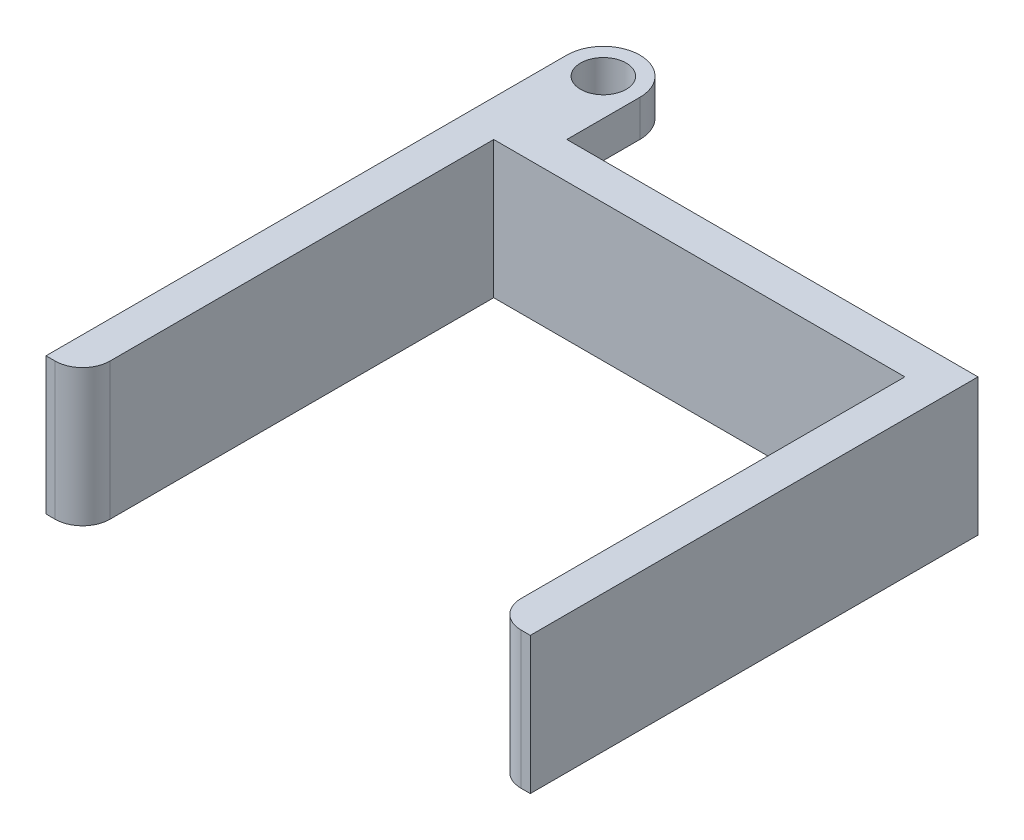
ISO-10303-21;
HEADER;
FILE_DESCRIPTION(('STEP AP214'),'2;1');
FILE_NAME('part.step','',(''),(''),'','','');
FILE_SCHEMA(('AUTOMOTIVE_DESIGN { 1 0 10303 214 1 1 1 1 }'));
ENDSEC;
DATA;
#1=APPLICATION_CONTEXT('core data for automotive mechanical design processes');
#2=APPLICATION_PROTOCOL_DEFINITION('international standard','automotive_design',2000,#1);
#3=PRODUCT_CONTEXT('',#1,'mechanical');
#4=PRODUCT('Part','Part','',(#3));
#5=PRODUCT_RELATED_PRODUCT_CATEGORY('part','',(#4));
#6=PRODUCT_DEFINITION_FORMATION('','',#4);
#7=PRODUCT_DEFINITION_CONTEXT('part definition',#1,'design');
#8=PRODUCT_DEFINITION('design','',#6,#7);
#9=PRODUCT_DEFINITION_SHAPE('','',#8);
#10=(LENGTH_UNIT() NAMED_UNIT(*) SI_UNIT(.MILLI.,.METRE.));
#11=(NAMED_UNIT(*) PLANE_ANGLE_UNIT() SI_UNIT($,.RADIAN.));
#12=(NAMED_UNIT(*) SI_UNIT($,.STERADIAN.) SOLID_ANGLE_UNIT());
#13=UNCERTAINTY_MEASURE_WITH_UNIT(LENGTH_MEASURE(1.E-05),#10,'distance_accuracy_value','');
#14=(GEOMETRIC_REPRESENTATION_CONTEXT(3) GLOBAL_UNCERTAINTY_ASSIGNED_CONTEXT((#13)) GLOBAL_UNIT_ASSIGNED_CONTEXT((#10,
#11,#12)) REPRESENTATION_CONTEXT('',''));
#15=CARTESIAN_POINT('',(0.,0.,0.));
#16=DIRECTION('',(0.,0.,1.));
#17=DIRECTION('',(1.,0.,0.));
#18=AXIS2_PLACEMENT_3D('',#15,#16,#17);
#19=CARTESIAN_POINT('',(22.5,15.,0.));
#20=DIRECTION('',(-1.,0.,0.));
#21=DIRECTION('',(0.,0.,1.));
#22=AXIS2_PLACEMENT_3D('',#19,#20,#21);
#23=PLANE('',#22);
#24=DIRECTION('',(0.,0.,-1.));
#25=VECTOR('',#24,1.);
#26=CARTESIAN_POINT('',(22.5,0.,0.));
#27=LINE('',#26,#25);
#28=CARTESIAN_POINT('',(22.5,0.,19.5));
#29=VERTEX_POINT('',#28);
#30=CARTESIAN_POINT('',(22.5,0.,-22.5));
#31=VERTEX_POINT('',#30);
#32=EDGE_CURVE('E167',#29,#31,#27,.T.);
#33=ORIENTED_EDGE('',*,*,#32,.F.);
#34=DIRECTION('',(0.,-1.,0.));
#35=VECTOR('',#34,1.);
#36=CARTESIAN_POINT('',(22.5,15.,19.5));
#37=LINE('',#36,#35);
#38=CARTESIAN_POINT('',(22.5,15.,19.5));
#39=VERTEX_POINT('',#38);
#40=EDGE_CURVE('E207',#29,#39,#37,.F.);
#41=ORIENTED_EDGE('',*,*,#40,.T.);
#42=DIRECTION('',(0.,0.,-1.));
#43=VECTOR('',#42,1.);
#44=CARTESIAN_POINT('',(22.5,15.,0.));
#45=LINE('',#44,#43);
#46=CARTESIAN_POINT('',(22.5,15.,-22.5));
#47=VERTEX_POINT('',#46);
#48=EDGE_CURVE('E231',#39,#47,#45,.T.);
#49=ORIENTED_EDGE('',*,*,#48,.T.);
#50=DIRECTION('',(0.,-1.,0.));
#51=VECTOR('',#50,1.);
#52=CARTESIAN_POINT('',(22.5,15.,-22.5));
#53=LINE('',#52,#51);
#54=EDGE_CURVE('E237',#47,#31,#53,.T.);
#55=ORIENTED_EDGE('',*,*,#54,.T.);
#56=EDGE_LOOP('',(#33,#41,#49,#55));
#57=FACE_BOUND('',#56,.T.);
#58=ADVANCED_FACE('F33',(#57),#23,.T.);
#59=CARTESIAN_POINT('',(0.,15.,22.5));
#60=DIRECTION('',(0.,0.,-1.));
#61=DIRECTION('',(-1.,0.,0.));
#62=AXIS2_PLACEMENT_3D('',#59,#60,#61);
#63=PLANE('',#62);
#64=DIRECTION('',(1.,0.,0.));
#65=VECTOR('',#64,1.);
#66=CARTESIAN_POINT('',(0.,15.,22.5));
#67=LINE('',#66,#65);
#68=CARTESIAN_POINT('',(25.5,15.,22.5));
#69=VERTEX_POINT('',#68);
#70=CARTESIAN_POINT('',(26.5,15.,22.5));
#71=VERTEX_POINT('',#70);
#72=EDGE_CURVE('E272',#69,#71,#67,.T.);
#73=ORIENTED_EDGE('',*,*,#72,.F.);
#74=DIRECTION('',(0.,-1.,0.));
#75=VECTOR('',#74,1.);
#76=CARTESIAN_POINT('',(25.5,0.,22.5));
#77=LINE('',#76,#75);
#78=CARTESIAN_POINT('',(25.5,0.,22.5));
#79=VERTEX_POINT('',#78);
#80=EDGE_CURVE('E200',#69,#79,#77,.T.);
#81=ORIENTED_EDGE('',*,*,#80,.T.);
#82=DIRECTION('',(1.,0.,0.));
#83=VECTOR('',#82,1.);
#84=CARTESIAN_POINT('',(0.,0.,22.5));
#85=LINE('',#84,#83);
#86=CARTESIAN_POINT('',(26.5,0.,22.5));
#87=VERTEX_POINT('',#86);
#88=EDGE_CURVE('E252',#79,#87,#85,.T.);
#89=ORIENTED_EDGE('',*,*,#88,.T.);
#90=DIRECTION('',(0.,-1.,0.));
#91=VECTOR('',#90,1.);
#92=CARTESIAN_POINT('',(26.5,15.,22.5));
#93=LINE('',#92,#91);
#94=EDGE_CURVE('E186',#71,#87,#93,.T.);
#95=ORIENTED_EDGE('',*,*,#94,.F.);
#96=EDGE_LOOP('',(#73,#81,#89,#95));
#97=FACE_BOUND('',#96,.T.);
#98=ADVANCED_FACE('F283',(#97),#63,.F.);
#99=CARTESIAN_POINT('',(26.5,15.,0.));
#100=DIRECTION('',(-1.,0.,0.));
#101=DIRECTION('',(0.,0.,1.));
#102=AXIS2_PLACEMENT_3D('',#99,#100,#101);
#103=PLANE('',#102);
#104=DIRECTION('',(0.,0.,-1.));
#105=VECTOR('',#104,1.);
#106=CARTESIAN_POINT('',(26.5,0.,0.));
#107=LINE('',#106,#105);
#108=CARTESIAN_POINT('',(26.5,0.,-26.5));
#109=VERTEX_POINT('',#108);
#110=EDGE_CURVE('E254',#87,#109,#107,.T.);
#111=ORIENTED_EDGE('',*,*,#110,.T.);
#112=DIRECTION('',(0.,-1.,0.));
#113=VECTOR('',#112,1.);
#114=CARTESIAN_POINT('',(26.5,15.,-26.5));
#115=LINE('',#114,#113);
#116=CARTESIAN_POINT('',(26.5,15.,-26.5));
#117=VERTEX_POINT('',#116);
#118=EDGE_CURVE('E183',#117,#109,#115,.T.);
#119=ORIENTED_EDGE('',*,*,#118,.F.);
#120=DIRECTION('',(0.,0.,-1.));
#121=VECTOR('',#120,1.);
#122=CARTESIAN_POINT('',(26.5,15.,0.));
#123=LINE('',#122,#121);
#124=EDGE_CURVE('E267',#71,#117,#123,.T.);
#125=ORIENTED_EDGE('',*,*,#124,.F.);
#126=ORIENTED_EDGE('',*,*,#94,.T.);
#127=EDGE_LOOP('',(#111,#119,#125,#126));
#128=FACE_BOUND('',#127,.T.);
#129=ADVANCED_FACE('F287',(#128),#103,.F.);
#130=CARTESIAN_POINT('',(0.,15.,-26.5));
#131=DIRECTION('',(0.,0.,-1.));
#132=DIRECTION('',(-1.,0.,0.));
#133=AXIS2_PLACEMENT_3D('',#130,#131,#132);
#134=PLANE('',#133);
#135=DIRECTION('',(-1.,0.,0.));
#136=VECTOR('',#135,1.);
#137=CARTESIAN_POINT('',(0.,11.,-26.5));
#138=LINE('',#137,#136);
#139=CARTESIAN_POINT('',(-18.5,11.,-26.5));
#140=VERTEX_POINT('',#139);
#141=CARTESIAN_POINT('',(-26.5,11.,-26.5));
#142=VERTEX_POINT('',#141);
#143=EDGE_CURVE('E155',#140,#142,#138,.T.);
#144=ORIENTED_EDGE('',*,*,#143,.F.);
#145=DIRECTION('',(0.,1.,0.));
#146=VECTOR('',#145,1.);
#147=CARTESIAN_POINT('',(-18.5,11.,-26.5));
#148=LINE('',#147,#146);
#149=CARTESIAN_POINT('',(-18.5,15.,-26.5));
#150=VERTEX_POINT('',#149);
#151=EDGE_CURVE('E144',#140,#150,#148,.T.);
#152=ORIENTED_EDGE('',*,*,#151,.T.);
#153=DIRECTION('',(1.,0.,0.));
#154=VECTOR('',#153,1.);
#155=CARTESIAN_POINT('',(0.,15.,-26.5));
#156=LINE('',#155,#154);
#157=EDGE_CURVE('E193',#150,#117,#156,.T.);
#158=ORIENTED_EDGE('',*,*,#157,.T.);
#159=ORIENTED_EDGE('',*,*,#118,.T.);
#160=DIRECTION('',(1.,0.,0.));
#161=VECTOR('',#160,1.);
#162=CARTESIAN_POINT('',(0.,0.,-26.5));
#163=LINE('',#162,#161);
#164=CARTESIAN_POINT('',(-26.5,0.,-26.5));
#165=VERTEX_POINT('',#164);
#166=EDGE_CURVE('E181',#165,#109,#163,.T.);
#167=ORIENTED_EDGE('',*,*,#166,.F.);
#168=DIRECTION('',(0.,-1.,0.));
#169=VECTOR('',#168,1.);
#170=CARTESIAN_POINT('',(-26.5,15.,-26.5));
#171=LINE('',#170,#169);
#172=EDGE_CURVE('E177',#142,#165,#171,.T.);
#173=ORIENTED_EDGE('',*,*,#172,.F.);
#174=EDGE_LOOP('',(#144,#152,#158,#159,#167,#173));
#175=FACE_BOUND('',#174,.T.);
#176=ADVANCED_FACE('F179',(#175),#134,.T.);
#177=CARTESIAN_POINT('',(-26.5,15.,0.));
#178=DIRECTION('',(-1.,0.,0.));
#179=DIRECTION('',(0.,0.,1.));
#180=AXIS2_PLACEMENT_3D('',#177,#178,#179);
#181=PLANE('',#180);
#182=DIRECTION('',(0.,0.,-1.));
#183=VECTOR('',#182,1.);
#184=CARTESIAN_POINT('',(-26.5,0.,0.));
#185=LINE('',#184,#183);
#186=CARTESIAN_POINT('',(-26.5,0.,22.5));
#187=VERTEX_POINT('',#186);
#188=EDGE_CURVE('E233',#187,#165,#185,.T.);
#189=ORIENTED_EDGE('',*,*,#188,.F.);
#190=DIRECTION('',(0.,-1.,0.));
#191=VECTOR('',#190,1.);
#192=CARTESIAN_POINT('',(-26.5,15.,22.5));
#193=LINE('',#192,#191);
#194=CARTESIAN_POINT('',(-26.5,15.,22.5));
#195=VERTEX_POINT('',#194);
#196=EDGE_CURVE('E184',#195,#187,#193,.T.);
#197=ORIENTED_EDGE('',*,*,#196,.F.);
#198=DIRECTION('',(0.,0.,-1.));
#199=VECTOR('',#198,1.);
#200=CARTESIAN_POINT('',(-26.5,15.,0.));
#201=LINE('',#200,#199);
#202=CARTESIAN_POINT('',(-26.5,15.,-34.5));
#203=VERTEX_POINT('',#202);
#204=EDGE_CURVE('E260',#195,#203,#201,.T.);
#205=ORIENTED_EDGE('',*,*,#204,.T.);
#206=DIRECTION('',(0.,1.,0.));
#207=VECTOR('',#206,1.);
#208=CARTESIAN_POINT('',(-26.5,11.,-34.5));
#209=LINE('',#208,#207);
#210=CARTESIAN_POINT('',(-26.5,11.,-34.5));
#211=VERTEX_POINT('',#210);
#212=EDGE_CURVE('E139',#211,#203,#209,.T.);
#213=ORIENTED_EDGE('',*,*,#212,.F.);
#214=DIRECTION('',(0.,0.,1.));
#215=VECTOR('',#214,1.);
#216=CARTESIAN_POINT('',(-26.5,11.,0.));
#217=LINE('',#216,#215);
#218=EDGE_CURVE('E153',#211,#142,#217,.T.);
#219=ORIENTED_EDGE('',*,*,#218,.T.);
#220=ORIENTED_EDGE('',*,*,#172,.T.);
#221=EDGE_LOOP('',(#189,#197,#205,#213,#219,#220));
#222=FACE_BOUND('',#221,.T.);
#223=ADVANCED_FACE('F176',(#222),#181,.T.);
#224=CARTESIAN_POINT('',(0.,15.,22.5));
#225=DIRECTION('',(0.,0.,-1.));
#226=DIRECTION('',(-1.,0.,0.));
#227=AXIS2_PLACEMENT_3D('',#224,#225,#226);
#228=PLANE('',#227);
#229=DIRECTION('',(1.,0.,0.));
#230=VECTOR('',#229,1.);
#231=CARTESIAN_POINT('',(0.,0.,22.5));
#232=LINE('',#231,#230);
#233=CARTESIAN_POINT('',(-25.5,0.,22.5));
#234=VERTEX_POINT('',#233);
#235=EDGE_CURVE('E229',#187,#234,#232,.T.);
#236=ORIENTED_EDGE('',*,*,#235,.T.);
#237=DIRECTION('',(0.,-1.,0.));
#238=VECTOR('',#237,1.);
#239=CARTESIAN_POINT('',(-25.5,15.,22.5));
#240=LINE('',#239,#238);
#241=CARTESIAN_POINT('',(-25.5,15.,22.5));
#242=VERTEX_POINT('',#241);
#243=EDGE_CURVE('E11',#234,#242,#240,.F.);
#244=ORIENTED_EDGE('',*,*,#243,.T.);
#245=DIRECTION('',(1.,0.,0.));
#246=VECTOR('',#245,1.);
#247=CARTESIAN_POINT('',(0.,15.,22.5));
#248=LINE('',#247,#246);
#249=EDGE_CURVE('E247',#195,#242,#248,.T.);
#250=ORIENTED_EDGE('',*,*,#249,.F.);
#251=ORIENTED_EDGE('',*,*,#196,.T.);
#252=EDGE_LOOP('',(#236,#244,#250,#251));
#253=FACE_BOUND('',#252,.T.);
#254=ADVANCED_FACE('F262',(#253),#228,.F.);
#255=CARTESIAN_POINT('',(-22.5,15.,0.));
#256=DIRECTION('',(-1.,0.,0.));
#257=DIRECTION('',(0.,0.,1.));
#258=AXIS2_PLACEMENT_3D('',#255,#256,#257);
#259=PLANE('',#258);
#260=DIRECTION('',(0.,0.,-1.));
#261=VECTOR('',#260,1.);
#262=CARTESIAN_POINT('',(-22.5,15.,0.));
#263=LINE('',#262,#261);
#264=CARTESIAN_POINT('',(-22.5,15.,19.5));
#265=VERTEX_POINT('',#264);
#266=CARTESIAN_POINT('',(-22.5,15.,-22.5));
#267=VERTEX_POINT('',#266);
#268=EDGE_CURVE('E219',#265,#267,#263,.T.);
#269=ORIENTED_EDGE('',*,*,#268,.F.);
#270=DIRECTION('',(0.,-1.,0.));
#271=VECTOR('',#270,1.);
#272=CARTESIAN_POINT('',(-22.5,15.,19.5));
#273=LINE('',#272,#271);
#274=CARTESIAN_POINT('',(-22.5,0.,19.5));
#275=VERTEX_POINT('',#274);
#276=EDGE_CURVE('E42',#265,#275,#273,.T.);
#277=ORIENTED_EDGE('',*,*,#276,.T.);
#278=DIRECTION('',(0.,0.,-1.));
#279=VECTOR('',#278,1.);
#280=CARTESIAN_POINT('',(-22.5,0.,0.));
#281=LINE('',#280,#279);
#282=CARTESIAN_POINT('',(-22.5,0.,-22.5));
#283=VERTEX_POINT('',#282);
#284=EDGE_CURVE('E217',#275,#283,#281,.T.);
#285=ORIENTED_EDGE('',*,*,#284,.T.);
#286=DIRECTION('',(0.,-1.,0.));
#287=VECTOR('',#286,1.);
#288=CARTESIAN_POINT('',(-22.5,15.,-22.5));
#289=LINE('',#288,#287);
#290=EDGE_CURVE('E188',#267,#283,#289,.T.);
#291=ORIENTED_EDGE('',*,*,#290,.F.);
#292=EDGE_LOOP('',(#269,#277,#285,#291));
#293=FACE_BOUND('',#292,.T.);
#294=ADVANCED_FACE('F215',(#293),#259,.F.);
#295=CARTESIAN_POINT('',(0.,15.,-22.5));
#296=DIRECTION('',(0.,0.,-1.));
#297=DIRECTION('',(-1.,0.,0.));
#298=AXIS2_PLACEMENT_3D('',#295,#296,#297);
#299=PLANE('',#298);
#300=DIRECTION('',(1.,0.,0.));
#301=VECTOR('',#300,1.);
#302=CARTESIAN_POINT('',(0.,0.,-22.5));
#303=LINE('',#302,#301);
#304=EDGE_CURVE('E228',#283,#31,#303,.T.);
#305=ORIENTED_EDGE('',*,*,#304,.T.);
#306=ORIENTED_EDGE('',*,*,#54,.F.);
#307=DIRECTION('',(1.,0.,0.));
#308=VECTOR('',#307,1.);
#309=CARTESIAN_POINT('',(0.,15.,-22.5));
#310=LINE('',#309,#308);
#311=EDGE_CURVE('E239',#267,#47,#310,.T.);
#312=ORIENTED_EDGE('',*,*,#311,.F.);
#313=ORIENTED_EDGE('',*,*,#290,.T.);
#314=EDGE_LOOP('',(#305,#306,#312,#313));
#315=FACE_BOUND('',#314,.T.);
#316=ADVANCED_FACE('F242',(#315),#299,.F.);
#317=CARTESIAN_POINT('',(0.,15.,0.));
#318=DIRECTION('',(0.,1.,0.));
#319=DIRECTION('',(0.,0.,1.));
#320=AXIS2_PLACEMENT_3D('',#317,#318,#319);
#321=PLANE('',#320);
#322=ORIENTED_EDGE('',*,*,#48,.F.);
#323=CARTESIAN_POINT('',(25.5,15.,19.5));
#324=DIRECTION('',(0.,1.,0.));
#325=DIRECTION('',(0.,0.,1.));
#326=AXIS2_PLACEMENT_3D('',#323,#324,#325);
#327=CIRCLE('',#326,3.);
#328=EDGE_CURVE('E210',#39,#69,#327,.T.);
#329=ORIENTED_EDGE('',*,*,#328,.T.);
#330=ORIENTED_EDGE('',*,*,#72,.T.);
#331=ORIENTED_EDGE('',*,*,#124,.T.);
#332=ORIENTED_EDGE('',*,*,#157,.F.);
#333=DIRECTION('',(0.,0.,1.));
#334=VECTOR('',#333,1.);
#335=CARTESIAN_POINT('',(-18.5,15.,0.));
#336=LINE('',#335,#334);
#337=CARTESIAN_POINT('',(-18.5,15.,-34.5));
#338=VERTEX_POINT('',#337);
#339=EDGE_CURVE('E50',#338,#150,#336,.T.);
#340=ORIENTED_EDGE('',*,*,#339,.F.);
#341=CARTESIAN_POINT('',(-22.5,15.,-34.5));
#342=DIRECTION('',(0.,1.,0.));
#343=DIRECTION('',(0.,0.,1.));
#344=AXIS2_PLACEMENT_3D('',#341,#342,#343);
#345=CIRCLE('',#344,4.);
#346=EDGE_CURVE('E138',#338,#203,#345,.T.);
#347=ORIENTED_EDGE('',*,*,#346,.T.);
#348=ORIENTED_EDGE('',*,*,#204,.F.);
#349=ORIENTED_EDGE('',*,*,#249,.T.);
#350=CARTESIAN_POINT('',(-25.5,15.,19.5));
#351=DIRECTION('',(0.,1.,0.));
#352=DIRECTION('',(0.,0.,1.));
#353=AXIS2_PLACEMENT_3D('',#350,#351,#352);
#354=CIRCLE('',#353,3.);
#355=EDGE_CURVE('E58',#242,#265,#354,.T.);
#356=ORIENTED_EDGE('',*,*,#355,.T.);
#357=ORIENTED_EDGE('',*,*,#268,.T.);
#358=ORIENTED_EDGE('',*,*,#311,.T.);
#359=EDGE_LOOP('',(#322,#329,#330,#331,#332,#340,#347,#348,#349,#356,#357,#358));
#360=FACE_BOUND('',#359,.T.);
#361=CARTESIAN_POINT('',(-22.5,15.,-34.5));
#362=DIRECTION('',(0.,1.,0.));
#363=DIRECTION('',(0.,0.,1.));
#364=AXIS2_PLACEMENT_3D('',#361,#362,#363);
#365=CIRCLE('',#364,2.5);
#366=CARTESIAN_POINT('',(-22.5,15.,-32.));
#367=VERTEX_POINT('',#366);
#368=EDGE_CURVE('E147',#367,#367,#365,.T.);
#369=ORIENTED_EDGE('',*,*,#368,.F.);
#370=EDGE_LOOP('',(#369));
#371=FACE_BOUND('',#370,.T.);
#372=ADVANCED_FACE('F264',(#360,#371),#321,.T.);
#373=CARTESIAN_POINT('',(0.,0.,0.));
#374=DIRECTION('',(0.,1.,0.));
#375=DIRECTION('',(0.,0.,1.));
#376=AXIS2_PLACEMENT_3D('',#373,#374,#375);
#377=PLANE('',#376);
#378=ORIENTED_EDGE('',*,*,#88,.F.);
#379=CARTESIAN_POINT('',(25.5,0.,19.5));
#380=DIRECTION('',(0.,1.,0.));
#381=DIRECTION('',(0.,0.,1.));
#382=AXIS2_PLACEMENT_3D('',#379,#380,#381);
#383=CIRCLE('',#382,3.);
#384=EDGE_CURVE('E205',#79,#29,#383,.F.);
#385=ORIENTED_EDGE('',*,*,#384,.T.);
#386=ORIENTED_EDGE('',*,*,#32,.T.);
#387=ORIENTED_EDGE('',*,*,#304,.F.);
#388=ORIENTED_EDGE('',*,*,#284,.F.);
#389=CARTESIAN_POINT('',(-25.5,0.,19.5));
#390=DIRECTION('',(0.,1.,0.));
#391=DIRECTION('',(0.,0.,1.));
#392=AXIS2_PLACEMENT_3D('',#389,#390,#391);
#393=CIRCLE('',#392,3.);
#394=EDGE_CURVE('E203',#275,#234,#393,.F.);
#395=ORIENTED_EDGE('',*,*,#394,.T.);
#396=ORIENTED_EDGE('',*,*,#235,.F.);
#397=ORIENTED_EDGE('',*,*,#188,.T.);
#398=ORIENTED_EDGE('',*,*,#166,.T.);
#399=ORIENTED_EDGE('',*,*,#110,.F.);
#400=EDGE_LOOP('',(#378,#385,#386,#387,#388,#395,#396,#397,#398,#399));
#401=FACE_BOUND('',#400,.T.);
#402=ADVANCED_FACE('F224',(#401),#377,.F.);
#403=CARTESIAN_POINT('',(25.5,15.,19.5));
#404=DIRECTION('',(0.,1.,0.));
#405=DIRECTION('',(0.,0.,1.));
#406=AXIS2_PLACEMENT_3D('',#403,#404,#405);
#407=CYLINDRICAL_SURFACE('',#406,3.);
#408=ORIENTED_EDGE('',*,*,#328,.F.);
#409=ORIENTED_EDGE('',*,*,#40,.F.);
#410=ORIENTED_EDGE('',*,*,#384,.F.);
#411=ORIENTED_EDGE('',*,*,#80,.F.);
#412=EDGE_LOOP('',(#408,#409,#410,#411));
#413=FACE_BOUND('',#412,.T.);
#414=ADVANCED_FACE('F281',(#413),#407,.T.);
#415=CARTESIAN_POINT('',(-25.5,15.,19.5));
#416=DIRECTION('',(0.,-1.,0.));
#417=DIRECTION('',(0.,0.,-1.));
#418=AXIS2_PLACEMENT_3D('',#415,#416,#417);
#419=CYLINDRICAL_SURFACE('',#418,3.);
#420=ORIENTED_EDGE('',*,*,#355,.F.);
#421=ORIENTED_EDGE('',*,*,#243,.F.);
#422=ORIENTED_EDGE('',*,*,#394,.F.);
#423=ORIENTED_EDGE('',*,*,#276,.F.);
#424=EDGE_LOOP('',(#420,#421,#422,#423));
#425=FACE_BOUND('',#424,.T.);
#426=ADVANCED_FACE('F35',(#425),#419,.T.);
#427=CARTESIAN_POINT('',(-18.5,11.,0.));
#428=DIRECTION('',(-1.,0.,0.));
#429=DIRECTION('',(0.,0.,1.));
#430=AXIS2_PLACEMENT_3D('',#427,#428,#429);
#431=PLANE('',#430);
#432=ORIENTED_EDGE('',*,*,#339,.T.);
#433=ORIENTED_EDGE('',*,*,#151,.F.);
#434=DIRECTION('',(0.,0.,1.));
#435=VECTOR('',#434,1.);
#436=CARTESIAN_POINT('',(-18.5,11.,0.));
#437=LINE('',#436,#435);
#438=CARTESIAN_POINT('',(-18.5,11.,-34.5));
#439=VERTEX_POINT('',#438);
#440=EDGE_CURVE('E142',#439,#140,#437,.T.);
#441=ORIENTED_EDGE('',*,*,#440,.F.);
#442=DIRECTION('',(0.,1.,0.));
#443=VECTOR('',#442,1.);
#444=CARTESIAN_POINT('',(-18.5,11.,-34.5));
#445=LINE('',#444,#443);
#446=EDGE_CURVE('E131',#439,#338,#445,.T.);
#447=ORIENTED_EDGE('',*,*,#446,.T.);
#448=EDGE_LOOP('',(#432,#433,#441,#447));
#449=FACE_BOUND('',#448,.T.);
#450=ADVANCED_FACE('F143',(#449),#431,.F.);
#451=CARTESIAN_POINT('',(-22.5,11.,-34.5));
#452=DIRECTION('',(0.,1.,0.));
#453=DIRECTION('',(0.,0.,1.));
#454=AXIS2_PLACEMENT_3D('',#451,#452,#453);
#455=CYLINDRICAL_SURFACE('',#454,4.);
#456=ORIENTED_EDGE('',*,*,#346,.F.);
#457=ORIENTED_EDGE('',*,*,#446,.F.);
#458=CARTESIAN_POINT('',(-22.5,11.,-34.5));
#459=DIRECTION('',(0.,1.,0.));
#460=DIRECTION('',(0.,0.,1.));
#461=AXIS2_PLACEMENT_3D('',#458,#459,#460);
#462=CIRCLE('',#461,4.);
#463=EDGE_CURVE('E136',#439,#211,#462,.T.);
#464=ORIENTED_EDGE('',*,*,#463,.T.);
#465=ORIENTED_EDGE('',*,*,#212,.T.);
#466=EDGE_LOOP('',(#456,#457,#464,#465));
#467=FACE_BOUND('',#466,.T.);
#468=ADVANCED_FACE('F133',(#467),#455,.T.);
#469=CARTESIAN_POINT('',(-22.5,11.,-34.5));
#470=DIRECTION('',(0.,1.,0.));
#471=DIRECTION('',(0.,0.,1.));
#472=AXIS2_PLACEMENT_3D('',#469,#470,#471);
#473=CYLINDRICAL_SURFACE('',#472,2.5);
#474=CARTESIAN_POINT('',(-22.5,11.,-34.5));
#475=DIRECTION('',(0.,1.,0.));
#476=DIRECTION('',(0.,0.,1.));
#477=AXIS2_PLACEMENT_3D('',#474,#475,#476);
#478=CIRCLE('',#477,2.5);
#479=CARTESIAN_POINT('',(-22.5,11.,-32.));
#480=VERTEX_POINT('',#479);
#481=EDGE_CURVE('E140',#480,#480,#478,.T.);
#482=ORIENTED_EDGE('',*,*,#481,.F.);
#483=EDGE_LOOP('',(#482));
#484=FACE_BOUND('',#483,.T.);
#485=ORIENTED_EDGE('',*,*,#368,.T.);
#486=EDGE_LOOP('',(#485));
#487=FACE_BOUND('',#486,.T.);
#488=ADVANCED_FACE('F341',(#484,#487),#473,.F.);
#489=CARTESIAN_POINT('',(0.,11.,0.));
#490=DIRECTION('',(0.,1.,0.));
#491=DIRECTION('',(0.,0.,1.));
#492=AXIS2_PLACEMENT_3D('',#489,#490,#491);
#493=PLANE('',#492);
#494=ORIENTED_EDGE('',*,*,#440,.T.);
#495=ORIENTED_EDGE('',*,*,#143,.T.);
#496=ORIENTED_EDGE('',*,*,#218,.F.);
#497=ORIENTED_EDGE('',*,*,#463,.F.);
#498=EDGE_LOOP('',(#494,#495,#496,#497));
#499=FACE_BOUND('',#498,.T.);
#500=ORIENTED_EDGE('',*,*,#481,.T.);
#501=EDGE_LOOP('',(#500));
#502=FACE_BOUND('',#501,.T.);
#503=ADVANCED_FACE('F150',(#499,#502),#493,.F.);
#504=CLOSED_SHELL('',(#58,#98,#129,#176,#223,#254,#294,#316,#372,#402,#414,#426,#450,#468,#488,#503));
#505=MANIFOLD_SOLID_BREP('B2',#504);
#506=ADVANCED_BREP_SHAPE_REPRESENTATION('',(#18,#505),#14);
#507=SHAPE_DEFINITION_REPRESENTATION(#9,#506);
ENDSEC;
END-ISO-10303-21;
